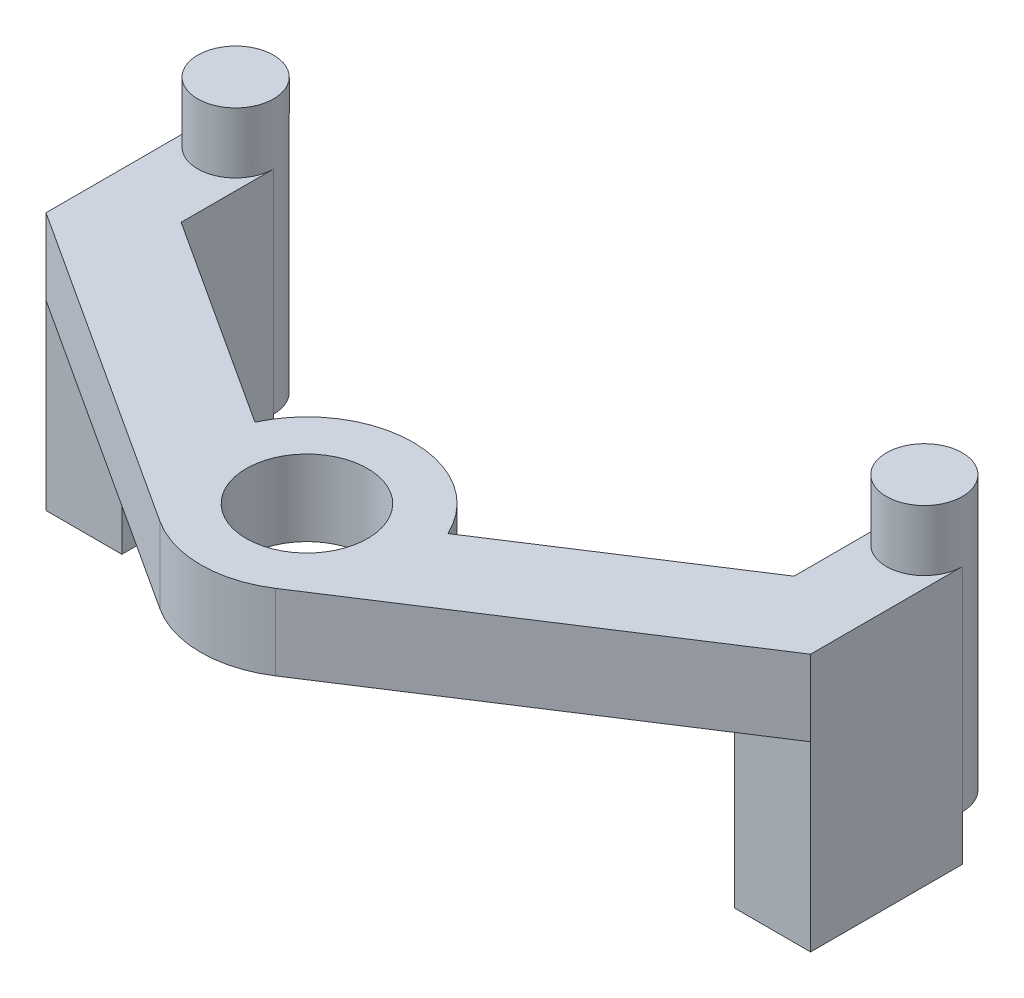
ISO-10303-21;
HEADER;
FILE_DESCRIPTION(('STEP AP214'),'2;1');
FILE_NAME('part.step','',(''),(''),'','','');
FILE_SCHEMA(('AUTOMOTIVE_DESIGN { 1 0 10303 214 1 1 1 1 }'));
ENDSEC;
DATA;
#1=APPLICATION_CONTEXT('core data for automotive mechanical design processes');
#2=APPLICATION_PROTOCOL_DEFINITION('international standard','automotive_design',2000,#1);
#3=PRODUCT_CONTEXT('',#1,'mechanical');
#4=PRODUCT('Part','Part','',(#3));
#5=PRODUCT_RELATED_PRODUCT_CATEGORY('part','',(#4));
#6=PRODUCT_DEFINITION_FORMATION('','',#4);
#7=PRODUCT_DEFINITION_CONTEXT('part definition',#1,'design');
#8=PRODUCT_DEFINITION('design','',#6,#7);
#9=PRODUCT_DEFINITION_SHAPE('','',#8);
#10=(LENGTH_UNIT() NAMED_UNIT(*) SI_UNIT(.MILLI.,.METRE.));
#11=(NAMED_UNIT(*) PLANE_ANGLE_UNIT() SI_UNIT($,.RADIAN.));
#12=(NAMED_UNIT(*) SI_UNIT($,.STERADIAN.) SOLID_ANGLE_UNIT());
#13=UNCERTAINTY_MEASURE_WITH_UNIT(LENGTH_MEASURE(1.E-05),#10,'distance_accuracy_value','');
#14=(GEOMETRIC_REPRESENTATION_CONTEXT(3) GLOBAL_UNCERTAINTY_ASSIGNED_CONTEXT((#13)) GLOBAL_UNIT_ASSIGNED_CONTEXT((#10,
#11,#12)) REPRESENTATION_CONTEXT('',''));
#15=CARTESIAN_POINT('',(0.,0.,0.));
#16=DIRECTION('',(0.,0.,1.));
#17=DIRECTION('',(1.,0.,0.));
#18=AXIS2_PLACEMENT_3D('',#15,#16,#17);
#19=CARTESIAN_POINT('',(0.,-7.,0.));
#20=DIRECTION('',(0.,1.,0.));
#21=DIRECTION('',(0.,0.,1.));
#22=AXIS2_PLACEMENT_3D('',#19,#20,#21);
#23=PLANE('',#22);
#24=DIRECTION('',(1.,0.,0.));
#25=VECTOR('',#24,1.);
#26=CARTESIAN_POINT('',(10.1,-7.,-9.00000000000001));
#27=LINE('',#26,#25);
#28=CARTESIAN_POINT('',(10.1,-7.,-9.));
#29=VERTEX_POINT('',#28);
#30=CARTESIAN_POINT('',(12.6,-7.,-9.));
#31=VERTEX_POINT('',#30);
#32=EDGE_CURVE('E177',#29,#31,#27,.T.);
#33=ORIENTED_EDGE('',*,*,#32,.F.);
#34=CARTESIAN_POINT('',(11.35,-7.,-9.));
#35=DIRECTION('',(0.,1.,0.));
#36=DIRECTION('',(0.,0.,1.));
#37=AXIS2_PLACEMENT_3D('',#34,#35,#36);
#38=CIRCLE('',#37,1.25);
#39=EDGE_CURVE('E174',#31,#29,#38,.T.);
#40=ORIENTED_EDGE('',*,*,#39,.F.);
#41=EDGE_LOOP('',(#33,#40));
#42=FACE_BOUND('',#41,.T.);
#43=ADVANCED_FACE('F45',(#42),#23,.F.);
#44=CARTESIAN_POINT('',(0.,-7.,0.));
#45=DIRECTION('',(0.,1.,0.));
#46=DIRECTION('',(0.,0.,1.));
#47=AXIS2_PLACEMENT_3D('',#44,#45,#46);
#48=PLANE('',#47);
#49=DIRECTION('',(1.,0.,0.));
#50=VECTOR('',#49,1.);
#51=CARTESIAN_POINT('',(-10.1,-7.,-9.));
#52=LINE('',#51,#50);
#53=CARTESIAN_POINT('',(-12.6,-7.,-9.));
#54=VERTEX_POINT('',#53);
#55=CARTESIAN_POINT('',(-10.1,-7.,-9.));
#56=VERTEX_POINT('',#55);
#57=EDGE_CURVE('E204',#54,#56,#52,.T.);
#58=ORIENTED_EDGE('',*,*,#57,.F.);
#59=CARTESIAN_POINT('',(-11.35,-7.,-9.));
#60=DIRECTION('',(0.,1.,0.));
#61=DIRECTION('',(0.,0.,1.));
#62=AXIS2_PLACEMENT_3D('',#59,#60,#61);
#63=CIRCLE('',#62,1.25);
#64=EDGE_CURVE('E275',#56,#54,#63,.T.);
#65=ORIENTED_EDGE('',*,*,#64,.F.);
#66=EDGE_LOOP('',(#58,#65));
#67=FACE_BOUND('',#66,.T.);
#68=ADVANCED_FACE('F405',(#67),#48,.F.);
#69=CARTESIAN_POINT('',(0.,-2.5,0.));
#70=DIRECTION('',(0.,1.,0.));
#71=DIRECTION('',(0.,0.,1.));
#72=AXIS2_PLACEMENT_3D('',#69,#70,#71);
#73=PLANE('',#72);
#74=CARTESIAN_POINT('',(0.,-2.5,0.));
#75=DIRECTION('',(0.,1.,0.));
#76=DIRECTION('',(0.,0.,1.));
#77=AXIS2_PLACEMENT_3D('',#74,#75,#76);
#78=CIRCLE('',#77,2.);
#79=CARTESIAN_POINT('',(0.,-2.5,2.));
#80=VERTEX_POINT('',#79);
#81=EDGE_CURVE('E313',#80,#80,#78,.T.);
#82=ORIENTED_EDGE('',*,*,#81,.T.);
#83=EDGE_LOOP('',(#82));
#84=FACE_BOUND('',#83,.T.);
#85=DIRECTION('',(-1.,0.,0.));
#86=VECTOR('',#85,1.);
#87=CARTESIAN_POINT('',(0.,-2.5,-4.));
#88=LINE('',#87,#86);
#89=CARTESIAN_POINT('',(12.6,-2.5,-4.));
#90=VERTEX_POINT('',#89);
#91=CARTESIAN_POINT('',(10.1,-2.5,-4.));
#92=VERTEX_POINT('',#91);
#93=EDGE_CURVE('E272',#90,#92,#88,.T.);
#94=ORIENTED_EDGE('',*,*,#93,.F.);
#95=DIRECTION('',(-0.839002384577408,0.,0.544127741135685));
#96=VECTOR('',#95,1.);
#97=CARTESIAN_POINT('',(1.9044470939749,-2.5,2.93650834602093));
#98=LINE('',#97,#96);
#99=CARTESIAN_POINT('',(1.9044470939749,-2.5,2.93650834602093));
#100=VERTEX_POINT('',#99);
#101=EDGE_CURVE('E303',#90,#100,#98,.T.);
#102=ORIENTED_EDGE('',*,*,#101,.T.);
#103=CARTESIAN_POINT('',(0.,-2.5,0.));
#104=DIRECTION('',(0.,1.,0.));
#105=DIRECTION('',(0.,0.,1.));
#106=AXIS2_PLACEMENT_3D('',#103,#104,#105);
#107=CIRCLE('',#106,3.5);
#108=CARTESIAN_POINT('',(-1.9044470939749,-2.5,2.93650834602093));
#109=VERTEX_POINT('',#108);
#110=EDGE_CURVE('E299',#109,#100,#107,.T.);
#111=ORIENTED_EDGE('',*,*,#110,.F.);
#112=DIRECTION('',(0.839002384577408,0.,0.544127741135685));
#113=VECTOR('',#112,1.);
#114=CARTESIAN_POINT('',(-1.9044470939749,-2.5,2.93650834602093));
#115=LINE('',#114,#113);
#116=CARTESIAN_POINT('',(-12.6,-2.5,-4.));
#117=VERTEX_POINT('',#116);
#118=EDGE_CURVE('E295',#117,#109,#115,.T.);
#119=ORIENTED_EDGE('',*,*,#118,.F.);
#120=DIRECTION('',(1.,0.,0.));
#121=VECTOR('',#120,1.);
#122=CARTESIAN_POINT('',(0.,-2.5,-4.));
#123=LINE('',#122,#121);
#124=CARTESIAN_POINT('',(-10.1,-2.5,-4.));
#125=VERTEX_POINT('',#124);
#126=EDGE_CURVE('E284',#117,#125,#123,.T.);
#127=ORIENTED_EDGE('',*,*,#126,.T.);
#128=DIRECTION('',(0.,0.,-1.));
#129=VECTOR('',#128,1.);
#130=CARTESIAN_POINT('',(-10.1,-2.5,0.));
#131=LINE('',#130,#129);
#132=CARTESIAN_POINT('',(-10.1,-2.5,-5.95432179610153));
#133=VERTEX_POINT('',#132);
#134=EDGE_CURVE('E291',#125,#133,#131,.T.);
#135=ORIENTED_EDGE('',*,*,#134,.T.);
#136=DIRECTION('',(0.839002384577408,0.,0.544127741135685));
#137=VECTOR('',#136,1.);
#138=CARTESIAN_POINT('',(-0.272063870567842,-2.5,0.419501192288704));
#139=LINE('',#138,#137);
#140=CARTESIAN_POINT('',(-3.17845338608687,-2.5,-1.46541259462068));
#141=VERTEX_POINT('',#140);
#142=EDGE_CURVE('E70',#133,#141,#139,.T.);
#143=ORIENTED_EDGE('',*,*,#142,.T.);
#144=CARTESIAN_POINT('',(3.17845338608687,-2.5,-1.46541259462068));
#145=VERTEX_POINT('',#144);
#146=EDGE_CURVE('E304',#145,#141,#107,.T.);
#147=ORIENTED_EDGE('',*,*,#146,.F.);
#148=DIRECTION('',(-0.839002384577408,0.,0.544127741135685));
#149=VECTOR('',#148,1.);
#150=CARTESIAN_POINT('',(0.272063870567842,-2.5,0.419501192288704));
#151=LINE('',#150,#149);
#152=CARTESIAN_POINT('',(10.1,-2.5,-5.95432179610153));
#153=VERTEX_POINT('',#152);
#154=EDGE_CURVE('E307',#153,#145,#151,.T.);
#155=ORIENTED_EDGE('',*,*,#154,.F.);
#156=DIRECTION('',(0.,0.,1.));
#157=VECTOR('',#156,1.);
#158=CARTESIAN_POINT('',(10.1,-2.5,0.));
#159=LINE('',#158,#157);
#160=EDGE_CURVE('E266',#153,#92,#159,.T.);
#161=ORIENTED_EDGE('',*,*,#160,.T.);
#162=EDGE_LOOP('',(#94,#102,#111,#119,#127,#135,#143,#147,#155,#161));
#163=FACE_BOUND('',#162,.T.);
#164=ADVANCED_FACE('F407',(#84,#163),#73,.F.);
#165=CARTESIAN_POINT('',(-11.35,-2.5,-9.));
#166=DIRECTION('',(0.,1.,0.));
#167=DIRECTION('',(0.,0.,1.));
#168=AXIS2_PLACEMENT_3D('',#165,#166,#167);
#169=CYLINDRICAL_SURFACE('',#168,1.25);
#170=DIRECTION('',(0.,1.,0.));
#171=VECTOR('',#170,1.);
#172=CARTESIAN_POINT('',(-12.6,-2.5,-9.));
#173=LINE('',#172,#171);
#174=CARTESIAN_POINT('',(-12.6,0.,-9.));
#175=VERTEX_POINT('',#174);
#176=EDGE_CURVE('E317',#54,#175,#173,.T.);
#177=ORIENTED_EDGE('',*,*,#176,.T.);
#178=CARTESIAN_POINT('',(-11.35,0.,-9.));
#179=DIRECTION('',(0.,1.,0.));
#180=DIRECTION('',(0.,0.,1.));
#181=AXIS2_PLACEMENT_3D('',#178,#179,#180);
#182=CIRCLE('',#181,1.25);
#183=CARTESIAN_POINT('',(-10.1,0.,-9.));
#184=VERTEX_POINT('',#183);
#185=EDGE_CURVE('E54',#175,#184,#182,.T.);
#186=ORIENTED_EDGE('',*,*,#185,.T.);
#187=DIRECTION('',(0.,1.,0.));
#188=VECTOR('',#187,1.);
#189=CARTESIAN_POINT('',(-10.1,-2.5,-9.));
#190=LINE('',#189,#188);
#191=EDGE_CURVE('E261',#56,#184,#190,.T.);
#192=ORIENTED_EDGE('',*,*,#191,.F.);
#193=ORIENTED_EDGE('',*,*,#64,.T.);
#194=EDGE_LOOP('',(#177,#186,#192,#193));
#195=FACE_BOUND('',#194,.T.);
#196=CARTESIAN_POINT('',(-11.35,2.,-9.));
#197=DIRECTION('',(0.,1.,0.));
#198=DIRECTION('',(0.,0.,1.));
#199=AXIS2_PLACEMENT_3D('',#196,#197,#198);
#200=CIRCLE('',#199,1.25);
#201=CARTESIAN_POINT('',(-11.35,2.,-7.75));
#202=VERTEX_POINT('',#201);
#203=EDGE_CURVE('E183',#202,#202,#200,.T.);
#204=ORIENTED_EDGE('',*,*,#203,.F.);
#205=EDGE_LOOP('',(#204));
#206=FACE_BOUND('',#205,.T.);
#207=ADVANCED_FACE('F47',(#195,#206),#169,.T.);
#208=CARTESIAN_POINT('',(-10.1,-2.5,0.));
#209=DIRECTION('',(1.,0.,0.));
#210=DIRECTION('',(0.,0.,-1.));
#211=AXIS2_PLACEMENT_3D('',#208,#209,#210);
#212=PLANE('',#211);
#213=DIRECTION('',(0.,0.,-1.));
#214=VECTOR('',#213,1.);
#215=CARTESIAN_POINT('',(-10.1,0.,0.));
#216=LINE('',#215,#214);
#217=CARTESIAN_POINT('',(-10.1,0.,-5.95432179610153));
#218=VERTEX_POINT('',#217);
#219=EDGE_CURVE('E348',#218,#184,#216,.T.);
#220=ORIENTED_EDGE('',*,*,#219,.F.);
#221=DIRECTION('',(0.,1.,0.));
#222=VECTOR('',#221,1.);
#223=CARTESIAN_POINT('',(-10.1,-2.5,-5.95432179610153));
#224=LINE('',#223,#222);
#225=EDGE_CURVE('E109',#133,#218,#224,.T.);
#226=ORIENTED_EDGE('',*,*,#225,.F.);
#227=ORIENTED_EDGE('',*,*,#134,.F.);
#228=DIRECTION('',(0.,1.,0.));
#229=VECTOR('',#228,1.);
#230=CARTESIAN_POINT('',(-10.1,-7.,-4.));
#231=LINE('',#230,#229);
#232=CARTESIAN_POINT('',(-10.1,-8.5,-4.));
#233=VERTEX_POINT('',#232);
#234=EDGE_CURVE('E280',#233,#125,#231,.T.);
#235=ORIENTED_EDGE('',*,*,#234,.F.);
#236=DIRECTION('',(0.,0.,1.));
#237=VECTOR('',#236,1.);
#238=CARTESIAN_POINT('',(-10.1,-8.5,-4.));
#239=LINE('',#238,#237);
#240=CARTESIAN_POINT('',(-10.1,-8.5,-9.));
#241=VERTEX_POINT('',#240);
#242=EDGE_CURVE('E227',#241,#233,#239,.T.);
#243=ORIENTED_EDGE('',*,*,#242,.F.);
#244=DIRECTION('',(0.,1.,0.));
#245=VECTOR('',#244,1.);
#246=CARTESIAN_POINT('',(-10.1,-8.5,-9.));
#247=LINE('',#246,#245);
#248=EDGE_CURVE('E241',#241,#56,#247,.T.);
#249=ORIENTED_EDGE('',*,*,#248,.T.);
#250=ORIENTED_EDGE('',*,*,#191,.T.);
#251=EDGE_LOOP('',(#220,#226,#227,#235,#243,#249,#250));
#252=FACE_BOUND('',#251,.T.);
#253=ADVANCED_FACE('F398',(#252),#212,.T.);
#254=CARTESIAN_POINT('',(-0.272063870567842,-2.5,0.419501192288704));
#255=DIRECTION('',(-0.544127741135685,0.,0.839002384577408));
#256=DIRECTION('',(0.839002384577408,0.,0.544127741135685));
#257=AXIS2_PLACEMENT_3D('',#254,#255,#256);
#258=PLANE('',#257);
#259=DIRECTION('',(0.839002384577408,0.,0.544127741135685));
#260=VECTOR('',#259,1.);
#261=CARTESIAN_POINT('',(-0.272063870567842,0.,0.419501192288704));
#262=LINE('',#261,#260);
#263=CARTESIAN_POINT('',(-3.17845338608687,0.,-1.46541259462068));
#264=VERTEX_POINT('',#263);
#265=EDGE_CURVE('E345',#218,#264,#262,.T.);
#266=ORIENTED_EDGE('',*,*,#265,.T.);
#267=DIRECTION('',(0.,1.,0.));
#268=VECTOR('',#267,1.);
#269=CARTESIAN_POINT('',(-3.17845338608687,-2.5,-1.46541259462068));
#270=LINE('',#269,#268);
#271=EDGE_CURVE('E359',#141,#264,#270,.T.);
#272=ORIENTED_EDGE('',*,*,#271,.F.);
#273=ORIENTED_EDGE('',*,*,#142,.F.);
#274=ORIENTED_EDGE('',*,*,#225,.T.);
#275=EDGE_LOOP('',(#266,#272,#273,#274));
#276=FACE_BOUND('',#275,.T.);
#277=ADVANCED_FACE('F432',(#276),#258,.F.);
#278=CARTESIAN_POINT('',(0.,-2.5,0.));
#279=DIRECTION('',(0.,1.,0.));
#280=DIRECTION('',(0.,0.,1.));
#281=AXIS2_PLACEMENT_3D('',#278,#279,#280);
#282=CYLINDRICAL_SURFACE('',#281,3.5);
#283=CARTESIAN_POINT('',(0.,0.,0.));
#284=DIRECTION('',(0.,1.,0.));
#285=DIRECTION('',(0.,0.,1.));
#286=AXIS2_PLACEMENT_3D('',#283,#284,#285);
#287=CIRCLE('',#286,3.5);
#288=CARTESIAN_POINT('',(3.17845338608687,0.,-1.46541259462068));
#289=VERTEX_POINT('',#288);
#290=EDGE_CURVE('E330',#289,#264,#287,.T.);
#291=ORIENTED_EDGE('',*,*,#290,.F.);
#292=DIRECTION('',(0.,1.,0.));
#293=VECTOR('',#292,1.);
#294=CARTESIAN_POINT('',(3.17845338608687,-2.5,-1.46541259462068));
#295=LINE('',#294,#293);
#296=EDGE_CURVE('E362',#145,#289,#295,.T.);
#297=ORIENTED_EDGE('',*,*,#296,.F.);
#298=ORIENTED_EDGE('',*,*,#146,.T.);
#299=ORIENTED_EDGE('',*,*,#271,.T.);
#300=EDGE_LOOP('',(#291,#297,#298,#299));
#301=FACE_BOUND('',#300,.T.);
#302=ADVANCED_FACE('F435',(#301),#282,.T.);
#303=CARTESIAN_POINT('',(0.272063870567842,-2.5,0.419501192288704));
#304=DIRECTION('',(-0.544127741135685,0.,-0.839002384577408));
#305=DIRECTION('',(-0.839002384577408,0.,0.544127741135685));
#306=AXIS2_PLACEMENT_3D('',#303,#304,#305);
#307=PLANE('',#306);
#308=DIRECTION('',(-0.839002384577408,0.,0.544127741135685));
#309=VECTOR('',#308,1.);
#310=CARTESIAN_POINT('',(0.272063870567842,0.,0.419501192288704));
#311=LINE('',#310,#309);
#312=CARTESIAN_POINT('',(10.1,0.,-5.95432179610153));
#313=VERTEX_POINT('',#312);
#314=EDGE_CURVE('E341',#313,#289,#311,.T.);
#315=ORIENTED_EDGE('',*,*,#314,.F.);
#316=DIRECTION('',(0.,1.,0.));
#317=VECTOR('',#316,1.);
#318=CARTESIAN_POINT('',(10.1,-2.5,-5.95432179610153));
#319=LINE('',#318,#317);
#320=EDGE_CURVE('E365',#153,#313,#319,.T.);
#321=ORIENTED_EDGE('',*,*,#320,.F.);
#322=ORIENTED_EDGE('',*,*,#154,.T.);
#323=ORIENTED_EDGE('',*,*,#296,.T.);
#324=EDGE_LOOP('',(#315,#321,#322,#323));
#325=FACE_BOUND('',#324,.T.);
#326=ADVANCED_FACE('F438',(#325),#307,.T.);
#327=CARTESIAN_POINT('',(10.1,-2.5,0.));
#328=DIRECTION('',(-1.,0.,0.));
#329=DIRECTION('',(0.,0.,1.));
#330=AXIS2_PLACEMENT_3D('',#327,#328,#329);
#331=PLANE('',#330);
#332=DIRECTION('',(0.,0.,1.));
#333=VECTOR('',#332,1.);
#334=CARTESIAN_POINT('',(10.1,0.,0.));
#335=LINE('',#334,#333);
#336=CARTESIAN_POINT('',(10.1,0.,-9.));
#337=VERTEX_POINT('',#336);
#338=EDGE_CURVE('E337',#337,#313,#335,.T.);
#339=ORIENTED_EDGE('',*,*,#338,.F.);
#340=DIRECTION('',(0.,1.,0.));
#341=VECTOR('',#340,1.);
#342=CARTESIAN_POINT('',(10.1,-2.5,-9.));
#343=LINE('',#342,#341);
#344=EDGE_CURVE('E193',#29,#337,#343,.T.);
#345=ORIENTED_EDGE('',*,*,#344,.F.);
#346=DIRECTION('',(0.,1.,0.));
#347=VECTOR('',#346,1.);
#348=CARTESIAN_POINT('',(10.1,-8.5,-9.00000000000001));
#349=LINE('',#348,#347);
#350=CARTESIAN_POINT('',(10.1,-8.5,-9.00000000000001));
#351=VERTEX_POINT('',#350);
#352=EDGE_CURVE('E202',#351,#29,#349,.T.);
#353=ORIENTED_EDGE('',*,*,#352,.F.);
#354=DIRECTION('',(0.,0.,-1.));
#355=VECTOR('',#354,1.);
#356=CARTESIAN_POINT('',(10.1,-8.5,-4.));
#357=LINE('',#356,#355);
#358=CARTESIAN_POINT('',(10.1,-8.5,-4.));
#359=VERTEX_POINT('',#358);
#360=EDGE_CURVE('E205',#359,#351,#357,.T.);
#361=ORIENTED_EDGE('',*,*,#360,.F.);
#362=DIRECTION('',(0.,1.,0.));
#363=VECTOR('',#362,1.);
#364=CARTESIAN_POINT('',(10.1,-7.,-4.));
#365=LINE('',#364,#363);
#366=EDGE_CURVE('E61',#359,#92,#365,.T.);
#367=ORIENTED_EDGE('',*,*,#366,.T.);
#368=ORIENTED_EDGE('',*,*,#160,.F.);
#369=ORIENTED_EDGE('',*,*,#320,.T.);
#370=EDGE_LOOP('',(#339,#345,#353,#361,#367,#368,#369));
#371=FACE_BOUND('',#370,.T.);
#372=ADVANCED_FACE('F443',(#371),#331,.T.);
#373=CARTESIAN_POINT('',(11.35,-2.5,-9.));
#374=DIRECTION('',(0.,1.,0.));
#375=DIRECTION('',(0.,0.,1.));
#376=AXIS2_PLACEMENT_3D('',#373,#374,#375);
#377=CYLINDRICAL_SURFACE('',#376,1.25);
#378=ORIENTED_EDGE('',*,*,#344,.T.);
#379=CARTESIAN_POINT('',(11.35,0.,-9.));
#380=DIRECTION('',(0.,1.,0.));
#381=DIRECTION('',(0.,0.,1.));
#382=AXIS2_PLACEMENT_3D('',#379,#380,#381);
#383=CIRCLE('',#382,1.25);
#384=CARTESIAN_POINT('',(12.6,0.,-9.));
#385=VERTEX_POINT('',#384);
#386=EDGE_CURVE('E11',#385,#337,#383,.F.);
#387=ORIENTED_EDGE('',*,*,#386,.F.);
#388=DIRECTION('',(0.,1.,0.));
#389=VECTOR('',#388,1.);
#390=CARTESIAN_POINT('',(12.6,-2.5,-9.));
#391=LINE('',#390,#389);
#392=EDGE_CURVE('E186',#31,#385,#391,.T.);
#393=ORIENTED_EDGE('',*,*,#392,.F.);
#394=ORIENTED_EDGE('',*,*,#39,.T.);
#395=EDGE_LOOP('',(#378,#387,#393,#394));
#396=FACE_BOUND('',#395,.T.);
#397=CARTESIAN_POINT('',(11.35,2.,-9.));
#398=DIRECTION('',(0.,1.,0.));
#399=DIRECTION('',(0.,0.,1.));
#400=AXIS2_PLACEMENT_3D('',#397,#398,#399);
#401=CIRCLE('',#400,1.25);
#402=CARTESIAN_POINT('',(11.35,2.,-7.75));
#403=VERTEX_POINT('',#402);
#404=EDGE_CURVE('E252',#403,#403,#401,.T.);
#405=ORIENTED_EDGE('',*,*,#404,.F.);
#406=EDGE_LOOP('',(#405));
#407=FACE_BOUND('',#406,.T.);
#408=ADVANCED_FACE('F187',(#396,#407),#377,.T.);
#409=CARTESIAN_POINT('',(12.6,-2.5,0.));
#410=DIRECTION('',(-1.,0.,0.));
#411=DIRECTION('',(0.,0.,1.));
#412=AXIS2_PLACEMENT_3D('',#409,#410,#411);
#413=PLANE('',#412);
#414=DIRECTION('',(0.,0.,1.));
#415=VECTOR('',#414,1.);
#416=CARTESIAN_POINT('',(12.6,0.,0.));
#417=LINE('',#416,#415);
#418=CARTESIAN_POINT('',(12.6,0.,-4.));
#419=VERTEX_POINT('',#418);
#420=EDGE_CURVE('E334',#385,#419,#417,.T.);
#421=ORIENTED_EDGE('',*,*,#420,.T.);
#422=DIRECTION('',(0.,1.,0.));
#423=VECTOR('',#422,1.);
#424=CARTESIAN_POINT('',(12.6,-2.5,-4.));
#425=LINE('',#424,#423);
#426=EDGE_CURVE('E194',#90,#419,#425,.T.);
#427=ORIENTED_EDGE('',*,*,#426,.F.);
#428=DIRECTION('',(0.,1.,0.));
#429=VECTOR('',#428,1.);
#430=CARTESIAN_POINT('',(12.6,-7.,-4.));
#431=LINE('',#430,#429);
#432=CARTESIAN_POINT('',(12.6,-8.5,-4.));
#433=VERTEX_POINT('',#432);
#434=EDGE_CURVE('E263',#433,#90,#431,.T.);
#435=ORIENTED_EDGE('',*,*,#434,.F.);
#436=DIRECTION('',(0.,0.,1.));
#437=VECTOR('',#436,1.);
#438=CARTESIAN_POINT('',(12.6,-8.5,-9.));
#439=LINE('',#438,#437);
#440=CARTESIAN_POINT('',(12.6,-8.5,-9.));
#441=VERTEX_POINT('',#440);
#442=EDGE_CURVE('E209',#441,#433,#439,.T.);
#443=ORIENTED_EDGE('',*,*,#442,.F.);
#444=DIRECTION('',(0.,1.,0.));
#445=VECTOR('',#444,1.);
#446=CARTESIAN_POINT('',(12.6,-8.5,-9.));
#447=LINE('',#446,#445);
#448=EDGE_CURVE('E199',#441,#31,#447,.T.);
#449=ORIENTED_EDGE('',*,*,#448,.T.);
#450=ORIENTED_EDGE('',*,*,#392,.T.);
#451=EDGE_LOOP('',(#421,#427,#435,#443,#449,#450));
#452=FACE_BOUND('',#451,.T.);
#453=ADVANCED_FACE('F207',(#452),#413,.F.);
#454=CARTESIAN_POINT('',(1.9044470939749,-2.5,2.93650834602093));
#455=DIRECTION('',(-0.544127741135685,0.,-0.839002384577408));
#456=DIRECTION('',(-0.839002384577408,0.,0.544127741135685));
#457=AXIS2_PLACEMENT_3D('',#454,#455,#456);
#458=PLANE('',#457);
#459=DIRECTION('',(-0.839002384577408,0.,0.544127741135685));
#460=VECTOR('',#459,1.);
#461=CARTESIAN_POINT('',(1.9044470939749,0.,2.93650834602093));
#462=LINE('',#461,#460);
#463=CARTESIAN_POINT('',(1.9044470939749,0.,2.93650834602093));
#464=VERTEX_POINT('',#463);
#465=EDGE_CURVE('E329',#419,#464,#462,.T.);
#466=ORIENTED_EDGE('',*,*,#465,.T.);
#467=DIRECTION('',(0.,1.,0.));
#468=VECTOR('',#467,1.);
#469=CARTESIAN_POINT('',(1.9044470939749,-2.5,2.93650834602093));
#470=LINE('',#469,#468);
#471=EDGE_CURVE('E373',#100,#464,#470,.T.);
#472=ORIENTED_EDGE('',*,*,#471,.F.);
#473=ORIENTED_EDGE('',*,*,#101,.F.);
#474=ORIENTED_EDGE('',*,*,#426,.T.);
#475=EDGE_LOOP('',(#466,#472,#473,#474));
#476=FACE_BOUND('',#475,.T.);
#477=ADVANCED_FACE('F451',(#476),#458,.F.);
#478=CARTESIAN_POINT('',(-1.9044470939749,0.,2.93650834602093));
#479=VERTEX_POINT('',#478);
#480=EDGE_CURVE('E325',#479,#464,#287,.T.);
#481=ORIENTED_EDGE('',*,*,#480,.F.);
#482=DIRECTION('',(0.,1.,0.));
#483=VECTOR('',#482,1.);
#484=CARTESIAN_POINT('',(-1.9044470939749,-2.5,2.93650834602093));
#485=LINE('',#484,#483);
#486=EDGE_CURVE('E116',#109,#479,#485,.T.);
#487=ORIENTED_EDGE('',*,*,#486,.F.);
#488=ORIENTED_EDGE('',*,*,#110,.T.);
#489=ORIENTED_EDGE('',*,*,#471,.T.);
#490=EDGE_LOOP('',(#481,#487,#488,#489));
#491=FACE_BOUND('',#490,.T.);
#492=ADVANCED_FACE('F440',(#491),#282,.T.);
#493=CARTESIAN_POINT('',(-1.9044470939749,-2.5,2.93650834602093));
#494=DIRECTION('',(-0.544127741135685,0.,0.839002384577408));
#495=DIRECTION('',(0.839002384577408,0.,0.544127741135685));
#496=AXIS2_PLACEMENT_3D('',#493,#494,#495);
#497=PLANE('',#496);
#498=DIRECTION('',(0.839002384577408,0.,0.544127741135685));
#499=VECTOR('',#498,1.);
#500=CARTESIAN_POINT('',(-1.9044470939749,0.,2.93650834602093));
#501=LINE('',#500,#499);
#502=CARTESIAN_POINT('',(-12.6,0.,-4.));
#503=VERTEX_POINT('',#502);
#504=EDGE_CURVE('E321',#503,#479,#501,.T.);
#505=ORIENTED_EDGE('',*,*,#504,.F.);
#506=DIRECTION('',(0.,1.,0.));
#507=VECTOR('',#506,1.);
#508=CARTESIAN_POINT('',(-12.6,-2.5,-4.));
#509=LINE('',#508,#507);
#510=EDGE_CURVE('E378',#117,#503,#509,.T.);
#511=ORIENTED_EDGE('',*,*,#510,.F.);
#512=ORIENTED_EDGE('',*,*,#118,.T.);
#513=ORIENTED_EDGE('',*,*,#486,.T.);
#514=EDGE_LOOP('',(#505,#511,#512,#513));
#515=FACE_BOUND('',#514,.T.);
#516=ADVANCED_FACE('F455',(#515),#497,.T.);
#517=CARTESIAN_POINT('',(-12.6,-2.5,0.));
#518=DIRECTION('',(-1.,0.,0.));
#519=DIRECTION('',(0.,0.,1.));
#520=AXIS2_PLACEMENT_3D('',#517,#518,#519);
#521=PLANE('',#520);
#522=DIRECTION('',(0.,0.,1.));
#523=VECTOR('',#522,1.);
#524=CARTESIAN_POINT('',(-12.6,0.,0.));
#525=LINE('',#524,#523);
#526=EDGE_CURVE('E294',#175,#503,#525,.T.);
#527=ORIENTED_EDGE('',*,*,#526,.F.);
#528=ORIENTED_EDGE('',*,*,#176,.F.);
#529=DIRECTION('',(0.,1.,0.));
#530=VECTOR('',#529,1.);
#531=CARTESIAN_POINT('',(-12.6,-8.5,-9.));
#532=LINE('',#531,#530);
#533=CARTESIAN_POINT('',(-12.6,-8.5,-9.));
#534=VERTEX_POINT('',#533);
#535=EDGE_CURVE('E248',#534,#54,#532,.T.);
#536=ORIENTED_EDGE('',*,*,#535,.F.);
#537=DIRECTION('',(0.,0.,-1.));
#538=VECTOR('',#537,1.);
#539=CARTESIAN_POINT('',(-12.6,-8.5,-9.));
#540=LINE('',#539,#538);
#541=CARTESIAN_POINT('',(-12.6,-8.5,-4.));
#542=VERTEX_POINT('',#541);
#543=EDGE_CURVE('E235',#542,#534,#540,.T.);
#544=ORIENTED_EDGE('',*,*,#543,.F.);
#545=DIRECTION('',(0.,1.,0.));
#546=VECTOR('',#545,1.);
#547=CARTESIAN_POINT('',(-12.6,-7.,-4.));
#548=LINE('',#547,#546);
#549=EDGE_CURVE('E279',#542,#117,#548,.T.);
#550=ORIENTED_EDGE('',*,*,#549,.T.);
#551=ORIENTED_EDGE('',*,*,#510,.T.);
#552=EDGE_LOOP('',(#527,#528,#536,#544,#550,#551));
#553=FACE_BOUND('',#552,.T.);
#554=ADVANCED_FACE('F389',(#553),#521,.T.);
#555=CARTESIAN_POINT('',(0.,-2.5,0.));
#556=DIRECTION('',(0.,1.,0.));
#557=DIRECTION('',(0.,0.,1.));
#558=AXIS2_PLACEMENT_3D('',#555,#556,#557);
#559=CYLINDRICAL_SURFACE('',#558,2.);
#560=ORIENTED_EDGE('',*,*,#81,.F.);
#561=EDGE_LOOP('',(#560));
#562=FACE_BOUND('',#561,.T.);
#563=CARTESIAN_POINT('',(0.,0.,0.));
#564=DIRECTION('',(0.,1.,0.));
#565=DIRECTION('',(0.,0.,1.));
#566=AXIS2_PLACEMENT_3D('',#563,#564,#565);
#567=CIRCLE('',#566,2.);
#568=CARTESIAN_POINT('',(0.,0.,2.));
#569=VERTEX_POINT('',#568);
#570=EDGE_CURVE('E300',#569,#569,#567,.T.);
#571=ORIENTED_EDGE('',*,*,#570,.T.);
#572=EDGE_LOOP('',(#571));
#573=FACE_BOUND('',#572,.T.);
#574=ADVANCED_FACE('F426',(#562,#573),#559,.F.);
#575=CARTESIAN_POINT('',(0.,0.,0.));
#576=DIRECTION('',(0.,1.,0.));
#577=DIRECTION('',(0.,0.,1.));
#578=AXIS2_PLACEMENT_3D('',#575,#576,#577);
#579=PLANE('',#578);
#580=ORIENTED_EDGE('',*,*,#420,.F.);
#581=ORIENTED_EDGE('',*,*,#386,.T.);
#582=ORIENTED_EDGE('',*,*,#338,.T.);
#583=ORIENTED_EDGE('',*,*,#314,.T.);
#584=ORIENTED_EDGE('',*,*,#290,.T.);
#585=ORIENTED_EDGE('',*,*,#265,.F.);
#586=ORIENTED_EDGE('',*,*,#219,.T.);
#587=ORIENTED_EDGE('',*,*,#185,.F.);
#588=ORIENTED_EDGE('',*,*,#526,.T.);
#589=ORIENTED_EDGE('',*,*,#504,.T.);
#590=ORIENTED_EDGE('',*,*,#480,.T.);
#591=ORIENTED_EDGE('',*,*,#465,.F.);
#592=EDGE_LOOP('',(#580,#581,#582,#583,#584,#585,#586,#587,#588,#589,#590,#591));
#593=FACE_BOUND('',#592,.T.);
#594=ORIENTED_EDGE('',*,*,#570,.F.);
#595=EDGE_LOOP('',(#594));
#596=FACE_BOUND('',#595,.T.);
#597=ADVANCED_FACE('F393',(#593,#596),#579,.T.);
#598=CARTESIAN_POINT('',(0.,-7.,-4.));
#599=DIRECTION('',(0.,0.,1.));
#600=DIRECTION('',(1.,0.,0.));
#601=AXIS2_PLACEMENT_3D('',#598,#599,#600);
#602=PLANE('',#601);
#603=ORIENTED_EDGE('',*,*,#126,.F.);
#604=ORIENTED_EDGE('',*,*,#549,.F.);
#605=DIRECTION('',(-1.,0.,0.));
#606=VECTOR('',#605,1.);
#607=CARTESIAN_POINT('',(-12.6,-8.5,-4.));
#608=LINE('',#607,#606);
#609=EDGE_CURVE('E231',#233,#542,#608,.T.);
#610=ORIENTED_EDGE('',*,*,#609,.F.);
#611=ORIENTED_EDGE('',*,*,#234,.T.);
#612=EDGE_LOOP('',(#603,#604,#610,#611));
#613=FACE_BOUND('',#612,.T.);
#614=ADVANCED_FACE('F420',(#613),#602,.T.);
#615=CARTESIAN_POINT('',(0.,-7.,-4.));
#616=DIRECTION('',(0.,0.,-1.));
#617=DIRECTION('',(-1.,0.,0.));
#618=AXIS2_PLACEMENT_3D('',#615,#616,#617);
#619=PLANE('',#618);
#620=ORIENTED_EDGE('',*,*,#434,.T.);
#621=ORIENTED_EDGE('',*,*,#93,.T.);
#622=ORIENTED_EDGE('',*,*,#366,.F.);
#623=DIRECTION('',(-1.,0.,0.));
#624=VECTOR('',#623,1.);
#625=CARTESIAN_POINT('',(12.6,-8.5,-4.));
#626=LINE('',#625,#624);
#627=EDGE_CURVE('E211',#433,#359,#626,.T.);
#628=ORIENTED_EDGE('',*,*,#627,.F.);
#629=EDGE_LOOP('',(#620,#621,#622,#628));
#630=FACE_BOUND('',#629,.T.);
#631=ADVANCED_FACE('F419',(#630),#619,.F.);
#632=CARTESIAN_POINT('',(0.,2.,0.));
#633=DIRECTION('',(0.,1.,0.));
#634=DIRECTION('',(0.,0.,1.));
#635=AXIS2_PLACEMENT_3D('',#632,#633,#634);
#636=PLANE('',#635);
#637=ORIENTED_EDGE('',*,*,#203,.T.);
#638=EDGE_LOOP('',(#637));
#639=FACE_BOUND('',#638,.T.);
#640=ADVANCED_FACE('F475',(#639),#636,.T.);
#641=CARTESIAN_POINT('',(0.,2.,0.));
#642=DIRECTION('',(0.,1.,0.));
#643=DIRECTION('',(0.,0.,1.));
#644=AXIS2_PLACEMENT_3D('',#641,#642,#643);
#645=PLANE('',#644);
#646=ORIENTED_EDGE('',*,*,#404,.T.);
#647=EDGE_LOOP('',(#646));
#648=FACE_BOUND('',#647,.T.);
#649=ADVANCED_FACE('F484',(#648),#645,.T.);
#650=CARTESIAN_POINT('',(-10.1,-8.5,-9.));
#651=DIRECTION('',(0.,0.,1.));
#652=DIRECTION('',(1.,0.,0.));
#653=AXIS2_PLACEMENT_3D('',#650,#651,#652);
#654=PLANE('',#653);
#655=ORIENTED_EDGE('',*,*,#57,.T.);
#656=ORIENTED_EDGE('',*,*,#248,.F.);
#657=DIRECTION('',(1.,0.,0.));
#658=VECTOR('',#657,1.);
#659=CARTESIAN_POINT('',(-10.1,-8.5,-9.));
#660=LINE('',#659,#658);
#661=EDGE_CURVE('E238',#534,#241,#660,.T.);
#662=ORIENTED_EDGE('',*,*,#661,.F.);
#663=ORIENTED_EDGE('',*,*,#535,.T.);
#664=EDGE_LOOP('',(#655,#656,#662,#663));
#665=FACE_BOUND('',#664,.T.);
#666=ADVANCED_FACE('F402',(#665),#654,.F.);
#667=CARTESIAN_POINT('',(0.,-8.5,0.));
#668=DIRECTION('',(0.,1.,0.));
#669=DIRECTION('',(0.,0.,1.));
#670=AXIS2_PLACEMENT_3D('',#667,#668,#669);
#671=PLANE('',#670);
#672=ORIENTED_EDGE('',*,*,#242,.T.);
#673=ORIENTED_EDGE('',*,*,#609,.T.);
#674=ORIENTED_EDGE('',*,*,#543,.T.);
#675=ORIENTED_EDGE('',*,*,#661,.T.);
#676=EDGE_LOOP('',(#672,#673,#674,#675));
#677=FACE_BOUND('',#676,.T.);
#678=ADVANCED_FACE('F483',(#677),#671,.F.);
#679=CARTESIAN_POINT('',(10.1,-8.5,-9.00000000000001));
#680=DIRECTION('',(0.,0.,1.));
#681=DIRECTION('',(1.,0.,0.));
#682=AXIS2_PLACEMENT_3D('',#679,#680,#681);
#683=PLANE('',#682);
#684=ORIENTED_EDGE('',*,*,#32,.T.);
#685=ORIENTED_EDGE('',*,*,#448,.F.);
#686=DIRECTION('',(1.,0.,0.));
#687=VECTOR('',#686,1.);
#688=CARTESIAN_POINT('',(10.1,-8.5,-9.00000000000001));
#689=LINE('',#688,#687);
#690=EDGE_CURVE('E221',#351,#441,#689,.T.);
#691=ORIENTED_EDGE('',*,*,#690,.F.);
#692=ORIENTED_EDGE('',*,*,#352,.T.);
#693=EDGE_LOOP('',(#684,#685,#691,#692));
#694=FACE_BOUND('',#693,.T.);
#695=ADVANCED_FACE('F198',(#694),#683,.F.);
#696=CARTESIAN_POINT('',(0.,-8.5,0.));
#697=DIRECTION('',(0.,-1.,0.));
#698=DIRECTION('',(0.,0.,-1.));
#699=AXIS2_PLACEMENT_3D('',#696,#697,#698);
#700=PLANE('',#699);
#701=ORIENTED_EDGE('',*,*,#360,.T.);
#702=ORIENTED_EDGE('',*,*,#690,.T.);
#703=ORIENTED_EDGE('',*,*,#442,.T.);
#704=ORIENTED_EDGE('',*,*,#627,.T.);
#705=EDGE_LOOP('',(#701,#702,#703,#704));
#706=FACE_BOUND('',#705,.T.);
#707=ADVANCED_FACE('F500',(#706),#700,.T.);
#708=CLOSED_SHELL('',(#43,#68,#164,#207,#253,#277,#302,#326,#372,#408,#453,#477,#492,#516,#554,
#574,#597,#614,#631,#640,#649,#666,#678,#695,#707));
#709=MANIFOLD_SOLID_BREP('B2',#708);
#710=ADVANCED_BREP_SHAPE_REPRESENTATION('',(#18,#709),#14);
#711=SHAPE_DEFINITION_REPRESENTATION(#9,#710);
ENDSEC;
END-ISO-10303-21;
